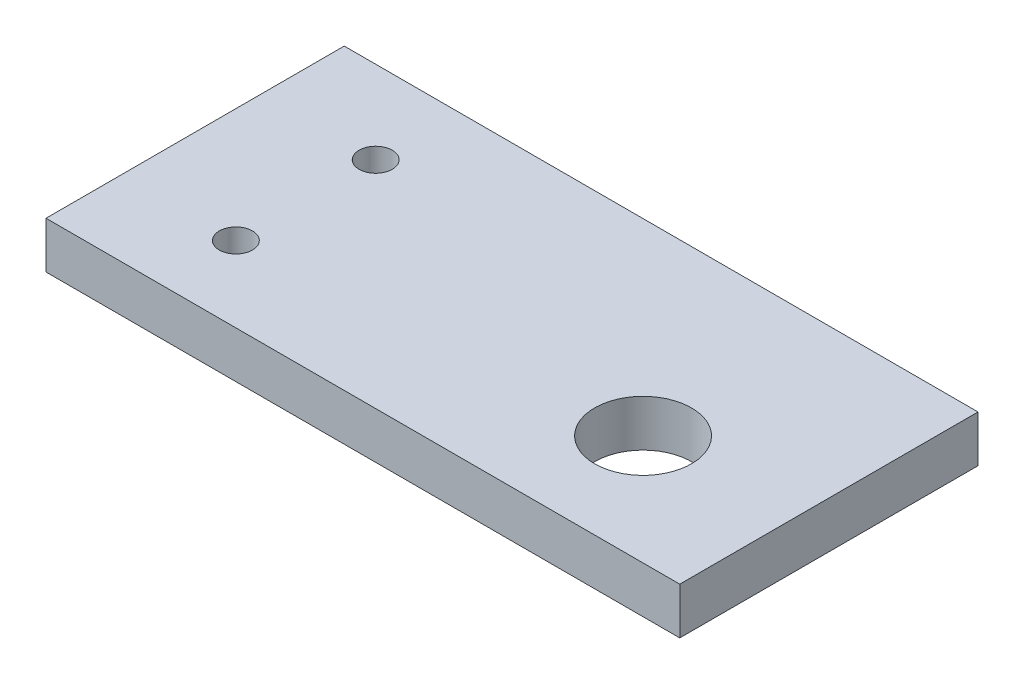
ISO-10303-21;
HEADER;
FILE_DESCRIPTION(('STEP AP214'),'2;1');
FILE_NAME('part.step','',(''),(''),'','','');
FILE_SCHEMA(('AUTOMOTIVE_DESIGN { 1 0 10303 214 1 1 1 1 }'));
ENDSEC;
DATA;
#1=APPLICATION_CONTEXT('core data for automotive mechanical design processes');
#2=APPLICATION_PROTOCOL_DEFINITION('international standard','automotive_design',2000,#1);
#3=PRODUCT_CONTEXT('',#1,'mechanical');
#4=PRODUCT('Part','Part','',(#3));
#5=PRODUCT_RELATED_PRODUCT_CATEGORY('part','',(#4));
#6=PRODUCT_DEFINITION_FORMATION('','',#4);
#7=PRODUCT_DEFINITION_CONTEXT('part definition',#1,'design');
#8=PRODUCT_DEFINITION('design','',#6,#7);
#9=PRODUCT_DEFINITION_SHAPE('','',#8);
#10=(LENGTH_UNIT() NAMED_UNIT(*) SI_UNIT(.MILLI.,.METRE.));
#11=(NAMED_UNIT(*) PLANE_ANGLE_UNIT() SI_UNIT($,.RADIAN.));
#12=(NAMED_UNIT(*) SI_UNIT($,.STERADIAN.) SOLID_ANGLE_UNIT());
#13=UNCERTAINTY_MEASURE_WITH_UNIT(LENGTH_MEASURE(1.E-05),#10,'distance_accuracy_value','');
#14=(GEOMETRIC_REPRESENTATION_CONTEXT(3) GLOBAL_UNCERTAINTY_ASSIGNED_CONTEXT((#13)) GLOBAL_UNIT_ASSIGNED_CONTEXT((#10,
#11,#12)) REPRESENTATION_CONTEXT('',''));
#15=CARTESIAN_POINT('',(0.,0.,0.));
#16=DIRECTION('',(0.,0.,1.));
#17=DIRECTION('',(1.,0.,0.));
#18=AXIS2_PLACEMENT_3D('',#15,#16,#17);
#19=CARTESIAN_POINT('',(0.,3.175,0.));
#20=DIRECTION('',(-1.,0.,0.));
#21=DIRECTION('',(0.,0.,1.));
#22=AXIS2_PLACEMENT_3D('',#19,#20,#21);
#23=PLANE('',#22);
#24=DIRECTION('',(0.,0.,-1.));
#25=VECTOR('',#24,1.);
#26=CARTESIAN_POINT('',(0.,0.,0.));
#27=LINE('',#26,#25);
#28=CARTESIAN_POINT('',(0.,0.,0.));
#29=VERTEX_POINT('',#28);
#30=CARTESIAN_POINT('',(0.,0.,-20.32));
#31=VERTEX_POINT('',#30);
#32=EDGE_CURVE('E105',#29,#31,#27,.T.);
#33=ORIENTED_EDGE('',*,*,#32,.F.);
#34=DIRECTION('',(0.,-1.,0.));
#35=VECTOR('',#34,1.);
#36=CARTESIAN_POINT('',(0.,3.175,0.));
#37=LINE('',#36,#35);
#38=CARTESIAN_POINT('',(0.,3.175,0.));
#39=VERTEX_POINT('',#38);
#40=EDGE_CURVE('E11',#39,#29,#37,.T.);
#41=ORIENTED_EDGE('',*,*,#40,.F.);
#42=DIRECTION('',(0.,0.,-1.));
#43=VECTOR('',#42,1.);
#44=CARTESIAN_POINT('',(0.,3.175,0.));
#45=LINE('',#44,#43);
#46=CARTESIAN_POINT('',(0.,3.175,-20.32));
#47=VERTEX_POINT('',#46);
#48=EDGE_CURVE('E89',#39,#47,#45,.T.);
#49=ORIENTED_EDGE('',*,*,#48,.T.);
#50=DIRECTION('',(0.,-1.,0.));
#51=VECTOR('',#50,1.);
#52=CARTESIAN_POINT('',(0.,3.175,-20.32));
#53=LINE('',#52,#51);
#54=EDGE_CURVE('E51',#47,#31,#53,.T.);
#55=ORIENTED_EDGE('',*,*,#54,.T.);
#56=EDGE_LOOP('',(#33,#41,#49,#55));
#57=FACE_BOUND('',#56,.T.);
#58=ADVANCED_FACE('F34',(#57),#23,.T.);
#59=CARTESIAN_POINT('',(0.,3.175,0.));
#60=DIRECTION('',(0.,0.,-1.));
#61=DIRECTION('',(-1.,0.,0.));
#62=AXIS2_PLACEMENT_3D('',#59,#60,#61);
#63=PLANE('',#62);
#64=DIRECTION('',(1.,0.,0.));
#65=VECTOR('',#64,1.);
#66=CARTESIAN_POINT('',(0.,0.,0.));
#67=LINE('',#66,#65);
#68=CARTESIAN_POINT('',(43.18,0.,0.));
#69=VERTEX_POINT('',#68);
#70=EDGE_CURVE('E94',#29,#69,#67,.T.);
#71=ORIENTED_EDGE('',*,*,#70,.T.);
#72=DIRECTION('',(0.,-1.,0.));
#73=VECTOR('',#72,1.);
#74=CARTESIAN_POINT('',(43.18,3.175,0.));
#75=LINE('',#74,#73);
#76=CARTESIAN_POINT('',(43.18,3.175,0.));
#77=VERTEX_POINT('',#76);
#78=EDGE_CURVE('E43',#77,#69,#75,.T.);
#79=ORIENTED_EDGE('',*,*,#78,.F.);
#80=DIRECTION('',(1.,0.,0.));
#81=VECTOR('',#80,1.);
#82=CARTESIAN_POINT('',(0.,3.175,0.));
#83=LINE('',#82,#81);
#84=EDGE_CURVE('E85',#39,#77,#83,.T.);
#85=ORIENTED_EDGE('',*,*,#84,.F.);
#86=ORIENTED_EDGE('',*,*,#40,.T.);
#87=EDGE_LOOP('',(#71,#79,#85,#86));
#88=FACE_BOUND('',#87,.T.);
#89=ADVANCED_FACE('F92',(#88),#63,.F.);
#90=CARTESIAN_POINT('',(43.18,3.175,0.));
#91=DIRECTION('',(-1.,0.,0.));
#92=DIRECTION('',(0.,0.,1.));
#93=AXIS2_PLACEMENT_3D('',#90,#91,#92);
#94=PLANE('',#93);
#95=DIRECTION('',(0.,0.,-1.));
#96=VECTOR('',#95,1.);
#97=CARTESIAN_POINT('',(43.18,0.,0.));
#98=LINE('',#97,#96);
#99=CARTESIAN_POINT('',(43.18,0.,-20.32));
#100=VERTEX_POINT('',#99);
#101=EDGE_CURVE('E102',#69,#100,#98,.T.);
#102=ORIENTED_EDGE('',*,*,#101,.T.);
#103=DIRECTION('',(0.,-1.,0.));
#104=VECTOR('',#103,1.);
#105=CARTESIAN_POINT('',(43.18,3.175,-20.32));
#106=LINE('',#105,#104);
#107=CARTESIAN_POINT('',(43.18,3.175,-20.32));
#108=VERTEX_POINT('',#107);
#109=EDGE_CURVE('E65',#108,#100,#106,.T.);
#110=ORIENTED_EDGE('',*,*,#109,.F.);
#111=DIRECTION('',(0.,0.,-1.));
#112=VECTOR('',#111,1.);
#113=CARTESIAN_POINT('',(43.18,3.175,0.));
#114=LINE('',#113,#112);
#115=EDGE_CURVE('E77',#77,#108,#114,.T.);
#116=ORIENTED_EDGE('',*,*,#115,.F.);
#117=ORIENTED_EDGE('',*,*,#78,.T.);
#118=EDGE_LOOP('',(#102,#110,#116,#117));
#119=FACE_BOUND('',#118,.T.);
#120=ADVANCED_FACE('F79',(#119),#94,.F.);
#121=CARTESIAN_POINT('',(33.18,3.175,-7.5));
#122=DIRECTION('',(0.,-1.,0.));
#123=DIRECTION('',(0.,0.,-1.));
#124=AXIS2_PLACEMENT_3D('',#121,#122,#123);
#125=CYLINDRICAL_SURFACE('',#124,3.30000000000001);
#126=CARTESIAN_POINT('',(33.18,3.175,-7.5));
#127=DIRECTION('',(0.,1.,0.));
#128=DIRECTION('',(0.,0.,1.));
#129=AXIS2_PLACEMENT_3D('',#126,#127,#128);
#130=CIRCLE('',#129,3.30000000000001);
#131=CARTESIAN_POINT('',(33.18,3.175,-4.19999999999999));
#132=VERTEX_POINT('',#131);
#133=EDGE_CURVE('E101',#132,#132,#130,.T.);
#134=ORIENTED_EDGE('',*,*,#133,.T.);
#135=EDGE_LOOP('',(#134));
#136=FACE_BOUND('',#135,.T.);
#137=CARTESIAN_POINT('',(33.18,0.,-7.5));
#138=DIRECTION('',(0.,1.,0.));
#139=DIRECTION('',(0.,0.,1.));
#140=AXIS2_PLACEMENT_3D('',#137,#138,#139);
#141=CIRCLE('',#140,3.30000000000001);
#142=CARTESIAN_POINT('',(33.18,0.,-4.19999999999999));
#143=VERTEX_POINT('',#142);
#144=EDGE_CURVE('E107',#143,#143,#141,.T.);
#145=ORIENTED_EDGE('',*,*,#144,.F.);
#146=EDGE_LOOP('',(#145));
#147=FACE_BOUND('',#146,.T.);
#148=ADVANCED_FACE('F36',(#136,#147),#125,.F.);
#149=CARTESIAN_POINT('',(0.,3.175,-20.32));
#150=DIRECTION('',(0.,0.,-1.));
#151=DIRECTION('',(-1.,0.,0.));
#152=AXIS2_PLACEMENT_3D('',#149,#150,#151);
#153=PLANE('',#152);
#154=DIRECTION('',(1.,0.,0.));
#155=VECTOR('',#154,1.);
#156=CARTESIAN_POINT('',(0.,0.,-20.32));
#157=LINE('',#156,#155);
#158=EDGE_CURVE('E98',#31,#100,#157,.T.);
#159=ORIENTED_EDGE('',*,*,#158,.F.);
#160=ORIENTED_EDGE('',*,*,#54,.F.);
#161=DIRECTION('',(1.,0.,0.));
#162=VECTOR('',#161,1.);
#163=CARTESIAN_POINT('',(0.,3.175,-20.32));
#164=LINE('',#163,#162);
#165=EDGE_CURVE('E84',#47,#108,#164,.T.);
#166=ORIENTED_EDGE('',*,*,#165,.T.);
#167=ORIENTED_EDGE('',*,*,#109,.T.);
#168=EDGE_LOOP('',(#159,#160,#166,#167));
#169=FACE_BOUND('',#168,.T.);
#170=ADVANCED_FACE('F139',(#169),#153,.T.);
#171=CARTESIAN_POINT('',(0.,3.175,0.));
#172=DIRECTION('',(0.,1.,0.));
#173=DIRECTION('',(0.,0.,1.));
#174=AXIS2_PLACEMENT_3D('',#171,#172,#173);
#175=PLANE('',#174);
#176=CARTESIAN_POINT('',(7.77999993400001,3.175,-14.6812));
#177=DIRECTION('',(0.,1.,0.));
#178=DIRECTION('',(0.,0.,1.));
#179=AXIS2_PLACEMENT_3D('',#176,#177,#178);
#180=CIRCLE('',#179,1.1303);
#181=CARTESIAN_POINT('',(7.77999993400001,3.175,-13.5509));
#182=VERTEX_POINT('',#181);
#183=EDGE_CURVE('E121',#182,#182,#180,.T.);
#184=ORIENTED_EDGE('',*,*,#183,.F.);
#185=EDGE_LOOP('',(#184));
#186=FACE_BOUND('',#185,.T.);
#187=CARTESIAN_POINT('',(7.77999993400001,3.175,-5.1562));
#188=DIRECTION('',(0.,1.,0.));
#189=DIRECTION('',(0.,0.,1.));
#190=AXIS2_PLACEMENT_3D('',#187,#188,#189);
#191=CIRCLE('',#190,1.1303);
#192=CARTESIAN_POINT('',(7.77999993400001,3.175,-4.0259));
#193=VERTEX_POINT('',#192);
#194=EDGE_CURVE('E115',#193,#193,#191,.T.);
#195=ORIENTED_EDGE('',*,*,#194,.F.);
#196=EDGE_LOOP('',(#195));
#197=FACE_BOUND('',#196,.T.);
#198=ORIENTED_EDGE('',*,*,#133,.F.);
#199=EDGE_LOOP('',(#198));
#200=FACE_BOUND('',#199,.T.);
#201=ORIENTED_EDGE('',*,*,#48,.F.);
#202=ORIENTED_EDGE('',*,*,#84,.T.);
#203=ORIENTED_EDGE('',*,*,#115,.T.);
#204=ORIENTED_EDGE('',*,*,#165,.F.);
#205=EDGE_LOOP('',(#201,#202,#203,#204));
#206=FACE_BOUND('',#205,.T.);
#207=ADVANCED_FACE('F88',(#186,#197,#200,#206),#175,.T.);
#208=CARTESIAN_POINT('',(0.,0.,0.));
#209=DIRECTION('',(0.,1.,0.));
#210=DIRECTION('',(0.,0.,1.));
#211=AXIS2_PLACEMENT_3D('',#208,#209,#210);
#212=PLANE('',#211);
#213=CARTESIAN_POINT('',(7.77999993400001,0.,-14.6812));
#214=DIRECTION('',(0.,1.,0.));
#215=DIRECTION('',(0.,0.,1.));
#216=AXIS2_PLACEMENT_3D('',#213,#214,#215);
#217=CIRCLE('',#216,1.1303);
#218=CARTESIAN_POINT('',(7.77999993400001,0.,-13.5509));
#219=VERTEX_POINT('',#218);
#220=EDGE_CURVE('E118',#219,#219,#217,.T.);
#221=ORIENTED_EDGE('',*,*,#220,.T.);
#222=EDGE_LOOP('',(#221));
#223=FACE_BOUND('',#222,.T.);
#224=CARTESIAN_POINT('',(7.77999993400001,0.,-5.1562));
#225=DIRECTION('',(0.,1.,0.));
#226=DIRECTION('',(0.,0.,1.));
#227=AXIS2_PLACEMENT_3D('',#224,#225,#226);
#228=CIRCLE('',#227,1.1303);
#229=CARTESIAN_POINT('',(7.77999993400001,0.,-4.0259));
#230=VERTEX_POINT('',#229);
#231=EDGE_CURVE('E110',#230,#230,#228,.T.);
#232=ORIENTED_EDGE('',*,*,#231,.T.);
#233=EDGE_LOOP('',(#232));
#234=FACE_BOUND('',#233,.T.);
#235=ORIENTED_EDGE('',*,*,#144,.T.);
#236=EDGE_LOOP('',(#235));
#237=FACE_BOUND('',#236,.T.);
#238=ORIENTED_EDGE('',*,*,#32,.T.);
#239=ORIENTED_EDGE('',*,*,#158,.T.);
#240=ORIENTED_EDGE('',*,*,#101,.F.);
#241=ORIENTED_EDGE('',*,*,#70,.F.);
#242=EDGE_LOOP('',(#238,#239,#240,#241));
#243=FACE_BOUND('',#242,.T.);
#244=ADVANCED_FACE('F127',(#223,#234,#237,#243),#212,.F.);
#245=CARTESIAN_POINT('',(7.77999993400001,0.,-5.1562));
#246=DIRECTION('',(0.,1.,0.));
#247=DIRECTION('',(0.,0.,1.));
#248=AXIS2_PLACEMENT_3D('',#245,#246,#247);
#249=CYLINDRICAL_SURFACE('',#248,1.1303);
#250=ORIENTED_EDGE('',*,*,#231,.F.);
#251=EDGE_LOOP('',(#250));
#252=FACE_BOUND('',#251,.T.);
#253=ORIENTED_EDGE('',*,*,#194,.T.);
#254=EDGE_LOOP('',(#253));
#255=FACE_BOUND('',#254,.T.);
#256=ADVANCED_FACE('F133',(#252,#255),#249,.F.);
#257=CARTESIAN_POINT('',(7.77999993400001,0.,-14.6812));
#258=DIRECTION('',(0.,1.,0.));
#259=DIRECTION('',(0.,0.,1.));
#260=AXIS2_PLACEMENT_3D('',#257,#258,#259);
#261=CYLINDRICAL_SURFACE('',#260,1.1303);
#262=ORIENTED_EDGE('',*,*,#220,.F.);
#263=EDGE_LOOP('',(#262));
#264=FACE_BOUND('',#263,.T.);
#265=ORIENTED_EDGE('',*,*,#183,.T.);
#266=EDGE_LOOP('',(#265));
#267=FACE_BOUND('',#266,.T.);
#268=ADVANCED_FACE('F130',(#264,#267),#261,.F.);
#269=CLOSED_SHELL('',(#58,#89,#120,#148,#170,#207,#244,#256,#268));
#270=MANIFOLD_SOLID_BREP('B2',#269);
#271=ADVANCED_BREP_SHAPE_REPRESENTATION('',(#18,#270),#14);
#272=SHAPE_DEFINITION_REPRESENTATION(#9,#271);
ENDSEC;
END-ISO-10303-21;
